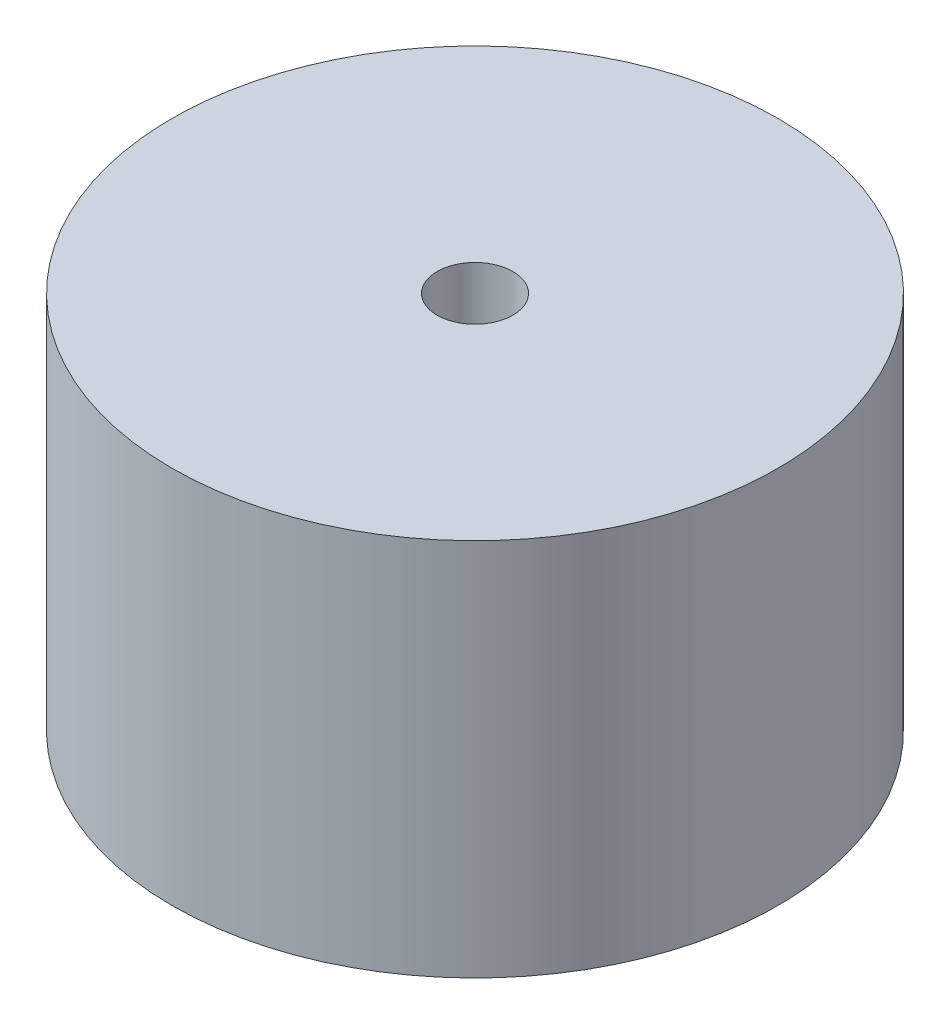
ISO-10303-21;
HEADER;
FILE_DESCRIPTION(('STEP AP214'),'2;1');
FILE_NAME('part.step','',(''),(''),'','','');
FILE_SCHEMA(('AUTOMOTIVE_DESIGN { 1 0 10303 214 1 1 1 1 }'));
ENDSEC;
DATA;
#1=APPLICATION_CONTEXT('core data for automotive mechanical design processes');
#2=APPLICATION_PROTOCOL_DEFINITION('international standard','automotive_design',2000,#1);
#3=PRODUCT_CONTEXT('',#1,'mechanical');
#4=PRODUCT('Part','Part','',(#3));
#5=PRODUCT_RELATED_PRODUCT_CATEGORY('part','',(#4));
#6=PRODUCT_DEFINITION_FORMATION('','',#4);
#7=PRODUCT_DEFINITION_CONTEXT('part definition',#1,'design');
#8=PRODUCT_DEFINITION('design','',#6,#7);
#9=PRODUCT_DEFINITION_SHAPE('','',#8);
#10=(LENGTH_UNIT() NAMED_UNIT(*) SI_UNIT(.MILLI.,.METRE.));
#11=(NAMED_UNIT(*) PLANE_ANGLE_UNIT() SI_UNIT($,.RADIAN.));
#12=(NAMED_UNIT(*) SI_UNIT($,.STERADIAN.) SOLID_ANGLE_UNIT());
#13=UNCERTAINTY_MEASURE_WITH_UNIT(LENGTH_MEASURE(1.E-05),#10,'distance_accuracy_value','');
#14=(GEOMETRIC_REPRESENTATION_CONTEXT(3) GLOBAL_UNCERTAINTY_ASSIGNED_CONTEXT((#13)) GLOBAL_UNIT_ASSIGNED_CONTEXT((#10,
#11,#12)) REPRESENTATION_CONTEXT('',''));
#15=CARTESIAN_POINT('',(0.,0.,0.));
#16=DIRECTION('',(0.,0.,1.));
#17=DIRECTION('',(1.,0.,0.));
#18=AXIS2_PLACEMENT_3D('',#15,#16,#17);
#19=CARTESIAN_POINT('',(0.,50.,0.));
#20=DIRECTION('',(0.,1.,0.));
#21=DIRECTION('',(0.,0.,1.));
#22=AXIS2_PLACEMENT_3D('',#19,#20,#21);
#23=PLANE('',#22);
#24=CARTESIAN_POINT('',(0.,50.,0.));
#25=DIRECTION('',(0.,1.,0.));
#26=DIRECTION('',(0.,0.,1.));
#27=AXIS2_PLACEMENT_3D('',#24,#25,#26);
#28=CIRCLE('',#27,40.);
#29=CARTESIAN_POINT('',(0.,50.,40.));
#30=VERTEX_POINT('',#29);
#31=EDGE_CURVE('E10',#30,#30,#28,.T.);
#32=ORIENTED_EDGE('',*,*,#31,.T.);
#33=EDGE_LOOP('',(#32));
#34=FACE_BOUND('',#33,.T.);
#35=CARTESIAN_POINT('',(0.,50.,0.));
#36=DIRECTION('',(0.,1.,0.));
#37=DIRECTION('',(0.,0.,1.));
#38=AXIS2_PLACEMENT_3D('',#35,#36,#37);
#39=CIRCLE('',#38,5.);
#40=CARTESIAN_POINT('',(0.,50.,5.));
#41=VERTEX_POINT('',#40);
#42=EDGE_CURVE('E50',#41,#41,#39,.T.);
#43=ORIENTED_EDGE('',*,*,#42,.F.);
#44=EDGE_LOOP('',(#43));
#45=FACE_BOUND('',#44,.T.);
#46=ADVANCED_FACE('F39',(#34,#45),#23,.T.);
#47=CARTESIAN_POINT('',(0.,0.,0.));
#48=DIRECTION('',(0.,1.,0.));
#49=DIRECTION('',(0.,0.,1.));
#50=AXIS2_PLACEMENT_3D('',#47,#48,#49);
#51=PLANE('',#50);
#52=CARTESIAN_POINT('',(0.,0.,0.));
#53=DIRECTION('',(0.,1.,0.));
#54=DIRECTION('',(0.,0.,1.));
#55=AXIS2_PLACEMENT_3D('',#52,#53,#54);
#56=CIRCLE('',#55,40.);
#57=CARTESIAN_POINT('',(0.,0.,40.));
#58=VERTEX_POINT('',#57);
#59=EDGE_CURVE('E43',#58,#58,#56,.T.);
#60=ORIENTED_EDGE('',*,*,#59,.F.);
#61=EDGE_LOOP('',(#60));
#62=FACE_BOUND('',#61,.T.);
#63=CARTESIAN_POINT('',(0.,0.,0.));
#64=DIRECTION('',(0.,1.,0.));
#65=DIRECTION('',(0.,0.,1.));
#66=AXIS2_PLACEMENT_3D('',#63,#64,#65);
#67=CIRCLE('',#66,5.);
#68=CARTESIAN_POINT('',(0.,0.,5.));
#69=VERTEX_POINT('',#68);
#70=EDGE_CURVE('E52',#69,#69,#67,.T.);
#71=ORIENTED_EDGE('',*,*,#70,.T.);
#72=EDGE_LOOP('',(#71));
#73=FACE_BOUND('',#72,.T.);
#74=ADVANCED_FACE('F62',(#62,#73),#51,.F.);
#75=CARTESIAN_POINT('',(0.,50.,0.));
#76=DIRECTION('',(0.,-1.,0.));
#77=DIRECTION('',(0.,0.,-1.));
#78=AXIS2_PLACEMENT_3D('',#75,#76,#77);
#79=CYLINDRICAL_SURFACE('',#78,40.);
#80=ORIENTED_EDGE('',*,*,#31,.F.);
#81=EDGE_LOOP('',(#80));
#82=FACE_BOUND('',#81,.T.);
#83=ORIENTED_EDGE('',*,*,#59,.T.);
#84=EDGE_LOOP('',(#83));
#85=FACE_BOUND('',#84,.T.);
#86=ADVANCED_FACE('F41',(#82,#85),#79,.T.);
#87=CARTESIAN_POINT('',(0.,50.,0.));
#88=DIRECTION('',(0.,-1.,0.));
#89=DIRECTION('',(0.,0.,-1.));
#90=AXIS2_PLACEMENT_3D('',#87,#88,#89);
#91=CYLINDRICAL_SURFACE('',#90,5.);
#92=ORIENTED_EDGE('',*,*,#42,.T.);
#93=EDGE_LOOP('',(#92));
#94=FACE_BOUND('',#93,.T.);
#95=ORIENTED_EDGE('',*,*,#70,.F.);
#96=EDGE_LOOP('',(#95));
#97=FACE_BOUND('',#96,.T.);
#98=ADVANCED_FACE('F58',(#94,#97),#91,.F.);
#99=CLOSED_SHELL('',(#46,#74,#86,#98));
#100=MANIFOLD_SOLID_BREP('B2',#99);
#101=ADVANCED_BREP_SHAPE_REPRESENTATION('',(#18,#100),#14);
#102=SHAPE_DEFINITION_REPRESENTATION(#9,#101);
ENDSEC;
END-ISO-10303-21;
